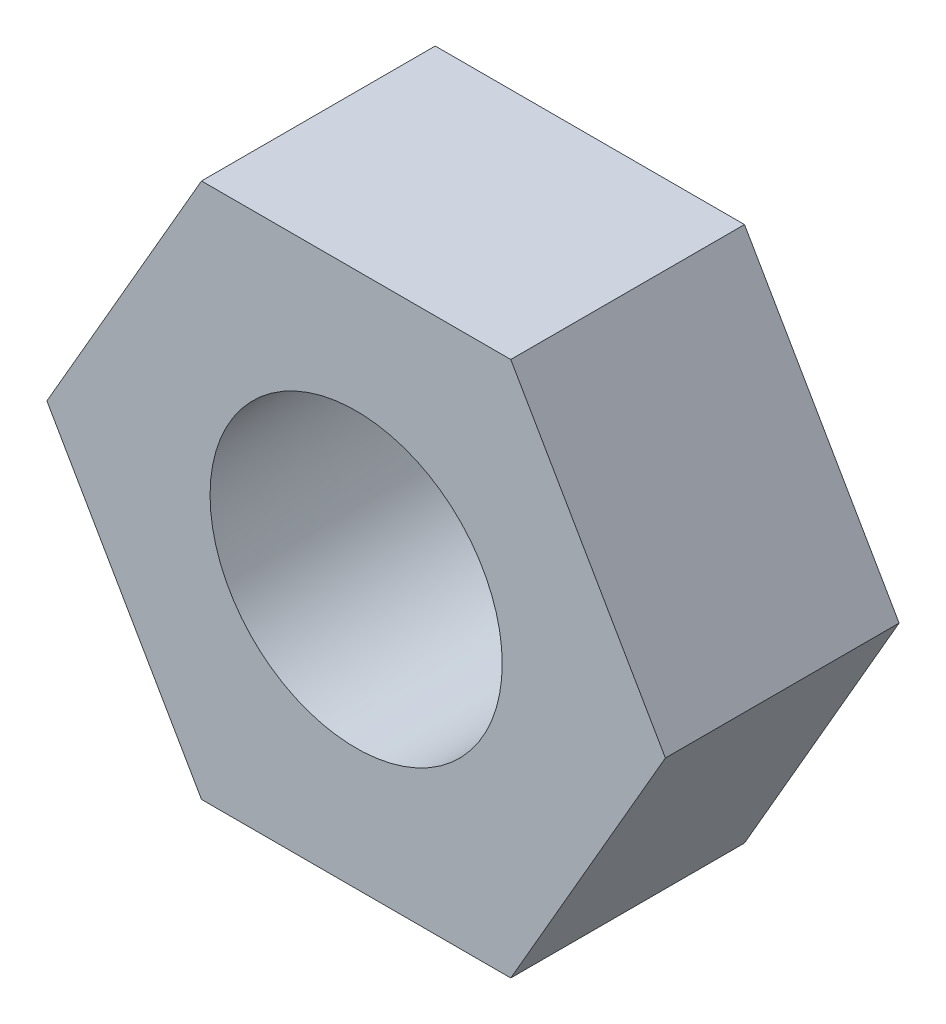
ISO-10303-21;
HEADER;
FILE_DESCRIPTION(('STEP AP214'),'2;1');
FILE_NAME('part.step','',(''),(''),'','','');
FILE_SCHEMA(('AUTOMOTIVE_DESIGN { 1 0 10303 214 1 1 1 1 }'));
ENDSEC;
DATA;
#1=APPLICATION_CONTEXT('core data for automotive mechanical design processes');
#2=APPLICATION_PROTOCOL_DEFINITION('international standard','automotive_design',2000,#1);
#3=PRODUCT_CONTEXT('',#1,'mechanical');
#4=PRODUCT('Part','Part','',(#3));
#5=PRODUCT_RELATED_PRODUCT_CATEGORY('part','',(#4));
#6=PRODUCT_DEFINITION_FORMATION('','',#4);
#7=PRODUCT_DEFINITION_CONTEXT('part definition',#1,'design');
#8=PRODUCT_DEFINITION('design','',#6,#7);
#9=PRODUCT_DEFINITION_SHAPE('','',#8);
#10=(LENGTH_UNIT() NAMED_UNIT(*) SI_UNIT(.MILLI.,.METRE.));
#11=(NAMED_UNIT(*) PLANE_ANGLE_UNIT() SI_UNIT($,.RADIAN.));
#12=(NAMED_UNIT(*) SI_UNIT($,.STERADIAN.) SOLID_ANGLE_UNIT());
#13=UNCERTAINTY_MEASURE_WITH_UNIT(LENGTH_MEASURE(1.E-05),#10,'distance_accuracy_value','');
#14=(GEOMETRIC_REPRESENTATION_CONTEXT(3) GLOBAL_UNCERTAINTY_ASSIGNED_CONTEXT((#13)) GLOBAL_UNIT_ASSIGNED_CONTEXT((#10,
#11,#12)) REPRESENTATION_CONTEXT('',''));
#15=CARTESIAN_POINT('',(0.,0.,0.));
#16=DIRECTION('',(0.,0.,1.));
#17=DIRECTION('',(1.,0.,0.));
#18=AXIS2_PLACEMENT_3D('',#15,#16,#17);
#19=CARTESIAN_POINT('',(1.58771324027147,-2.75,2.4));
#20=DIRECTION('',(-0.866025403784438,0.5,0.));
#21=DIRECTION('',(-0.5,-0.866025403784439,0.));
#22=AXIS2_PLACEMENT_3D('',#19,#20,#21);
#23=PLANE('',#22);
#24=DIRECTION('',(0.5,0.866025403784438,0.));
#25=VECTOR('',#24,1.);
#26=CARTESIAN_POINT('',(1.58771324027147,-2.75,0.));
#27=LINE('',#26,#25);
#28=CARTESIAN_POINT('',(1.58771324027147,-2.75,0.));
#29=VERTEX_POINT('',#28);
#30=CARTESIAN_POINT('',(3.17542648054294,0.,0.));
#31=VERTEX_POINT('',#30);
#32=EDGE_CURVE('E128',#29,#31,#27,.T.);
#33=ORIENTED_EDGE('',*,*,#32,.T.);
#34=DIRECTION('',(0.,0.,-1.));
#35=VECTOR('',#34,1.);
#36=CARTESIAN_POINT('',(3.17542648054294,0.,2.4));
#37=LINE('',#36,#35);
#38=CARTESIAN_POINT('',(3.17542648054294,0.,2.4));
#39=VERTEX_POINT('',#38);
#40=EDGE_CURVE('E11',#39,#31,#37,.T.);
#41=ORIENTED_EDGE('',*,*,#40,.F.);
#42=DIRECTION('',(0.5,0.866025403784438,0.));
#43=VECTOR('',#42,1.);
#44=CARTESIAN_POINT('',(1.58771324027147,-2.75,2.4));
#45=LINE('',#44,#43);
#46=CARTESIAN_POINT('',(1.58771324027147,-2.75,2.4));
#47=VERTEX_POINT('',#46);
#48=EDGE_CURVE('E145',#47,#39,#45,.T.);
#49=ORIENTED_EDGE('',*,*,#48,.F.);
#50=DIRECTION('',(0.,0.,-1.));
#51=VECTOR('',#50,1.);
#52=CARTESIAN_POINT('',(1.58771324027147,-2.75,2.4));
#53=LINE('',#52,#51);
#54=EDGE_CURVE('E124',#47,#29,#53,.T.);
#55=ORIENTED_EDGE('',*,*,#54,.T.);
#56=EDGE_LOOP('',(#33,#41,#49,#55));
#57=FACE_BOUND('',#56,.T.);
#58=ADVANCED_FACE('F39',(#57),#23,.F.);
#59=CARTESIAN_POINT('',(3.17542648054294,0.,2.4));
#60=DIRECTION('',(-0.866025403784439,-0.499999999999999,0.));
#61=DIRECTION('',(0.5,-0.866025403784439,0.));
#62=AXIS2_PLACEMENT_3D('',#59,#60,#61);
#63=PLANE('',#62);
#64=DIRECTION('',(-0.499999999999999,0.866025403784439,0.));
#65=VECTOR('',#64,1.);
#66=CARTESIAN_POINT('',(3.17542648054294,0.,0.));
#67=LINE('',#66,#65);
#68=CARTESIAN_POINT('',(1.58771324027147,2.75,0.));
#69=VERTEX_POINT('',#68);
#70=EDGE_CURVE('E132',#31,#69,#67,.T.);
#71=ORIENTED_EDGE('',*,*,#70,.T.);
#72=DIRECTION('',(0.,0.,-1.));
#73=VECTOR('',#72,1.);
#74=CARTESIAN_POINT('',(1.58771324027147,2.75,2.4));
#75=LINE('',#74,#73);
#76=CARTESIAN_POINT('',(1.58771324027147,2.75,2.4));
#77=VERTEX_POINT('',#76);
#78=EDGE_CURVE('E48',#77,#69,#75,.T.);
#79=ORIENTED_EDGE('',*,*,#78,.F.);
#80=DIRECTION('',(-0.499999999999999,0.866025403784439,0.));
#81=VECTOR('',#80,1.);
#82=CARTESIAN_POINT('',(3.17542648054294,0.,2.4));
#83=LINE('',#82,#81);
#84=EDGE_CURVE('E93',#39,#77,#83,.T.);
#85=ORIENTED_EDGE('',*,*,#84,.F.);
#86=ORIENTED_EDGE('',*,*,#40,.T.);
#87=EDGE_LOOP('',(#71,#79,#85,#86));
#88=FACE_BOUND('',#87,.T.);
#89=ADVANCED_FACE('F174',(#88),#63,.F.);
#90=CARTESIAN_POINT('',(1.58771324027147,2.75,2.4));
#91=DIRECTION('',(0.,-1.,0.));
#92=DIRECTION('',(0.,0.,-1.));
#93=AXIS2_PLACEMENT_3D('',#90,#91,#92);
#94=PLANE('',#93);
#95=DIRECTION('',(-1.,0.,0.));
#96=VECTOR('',#95,1.);
#97=CARTESIAN_POINT('',(1.58771324027147,2.75,0.));
#98=LINE('',#97,#96);
#99=CARTESIAN_POINT('',(-1.58771324027147,2.75,0.));
#100=VERTEX_POINT('',#99);
#101=EDGE_CURVE('E136',#69,#100,#98,.T.);
#102=ORIENTED_EDGE('',*,*,#101,.T.);
#103=DIRECTION('',(0.,0.,-1.));
#104=VECTOR('',#103,1.);
#105=CARTESIAN_POINT('',(-1.58771324027147,2.75,2.4));
#106=LINE('',#105,#104);
#107=CARTESIAN_POINT('',(-1.58771324027147,2.75,2.4));
#108=VERTEX_POINT('',#107);
#109=EDGE_CURVE('E117',#108,#100,#106,.T.);
#110=ORIENTED_EDGE('',*,*,#109,.F.);
#111=DIRECTION('',(-1.,0.,0.));
#112=VECTOR('',#111,1.);
#113=CARTESIAN_POINT('',(1.58771324027147,2.75,2.4));
#114=LINE('',#113,#112);
#115=EDGE_CURVE('E106',#77,#108,#114,.T.);
#116=ORIENTED_EDGE('',*,*,#115,.F.);
#117=ORIENTED_EDGE('',*,*,#78,.T.);
#118=EDGE_LOOP('',(#102,#110,#116,#117));
#119=FACE_BOUND('',#118,.T.);
#120=ADVANCED_FACE('F155',(#119),#94,.F.);
#121=CARTESIAN_POINT('',(-1.58771324027147,2.75,2.4));
#122=DIRECTION('',(0.866025403784438,-0.5,0.));
#123=DIRECTION('',(0.5,0.866025403784439,0.));
#124=AXIS2_PLACEMENT_3D('',#121,#122,#123);
#125=PLANE('',#124);
#126=DIRECTION('',(-0.5,-0.866025403784438,0.));
#127=VECTOR('',#126,1.);
#128=CARTESIAN_POINT('',(-1.58771324027147,2.75,0.));
#129=LINE('',#128,#127);
#130=CARTESIAN_POINT('',(-3.17542648054294,0.,0.));
#131=VERTEX_POINT('',#130);
#132=EDGE_CURVE('E115',#100,#131,#129,.T.);
#133=ORIENTED_EDGE('',*,*,#132,.T.);
#134=DIRECTION('',(0.,0.,-1.));
#135=VECTOR('',#134,1.);
#136=CARTESIAN_POINT('',(-3.17542648054294,0.,2.4));
#137=LINE('',#136,#135);
#138=CARTESIAN_POINT('',(-3.17542648054294,0.,2.4));
#139=VERTEX_POINT('',#138);
#140=EDGE_CURVE('E112',#139,#131,#137,.T.);
#141=ORIENTED_EDGE('',*,*,#140,.F.);
#142=DIRECTION('',(-0.5,-0.866025403784438,0.));
#143=VECTOR('',#142,1.);
#144=CARTESIAN_POINT('',(-1.58771324027147,2.75,2.4));
#145=LINE('',#144,#143);
#146=EDGE_CURVE('E100',#108,#139,#145,.T.);
#147=ORIENTED_EDGE('',*,*,#146,.F.);
#148=ORIENTED_EDGE('',*,*,#109,.T.);
#149=EDGE_LOOP('',(#133,#141,#147,#148));
#150=FACE_BOUND('',#149,.T.);
#151=ADVANCED_FACE('F113',(#150),#125,.F.);
#152=CARTESIAN_POINT('',(-3.17542648054294,0.,2.4));
#153=DIRECTION('',(0.866025403784439,0.5,0.));
#154=DIRECTION('',(-0.5,0.866025403784439,0.));
#155=AXIS2_PLACEMENT_3D('',#152,#153,#154);
#156=PLANE('',#155);
#157=DIRECTION('',(0.5,-0.866025403784439,0.));
#158=VECTOR('',#157,1.);
#159=CARTESIAN_POINT('',(-3.17542648054294,0.,0.));
#160=LINE('',#159,#158);
#161=CARTESIAN_POINT('',(-1.58771324027147,-2.75,0.));
#162=VERTEX_POINT('',#161);
#163=EDGE_CURVE('E79',#131,#162,#160,.T.);
#164=ORIENTED_EDGE('',*,*,#163,.T.);
#165=DIRECTION('',(0.,0.,-1.));
#166=VECTOR('',#165,1.);
#167=CARTESIAN_POINT('',(-1.58771324027147,-2.75,2.4));
#168=LINE('',#167,#166);
#169=CARTESIAN_POINT('',(-1.58771324027147,-2.75,2.4));
#170=VERTEX_POINT('',#169);
#171=EDGE_CURVE('E118',#170,#162,#168,.T.);
#172=ORIENTED_EDGE('',*,*,#171,.F.);
#173=DIRECTION('',(0.5,-0.866025403784439,0.));
#174=VECTOR('',#173,1.);
#175=CARTESIAN_POINT('',(-3.17542648054294,0.,2.4));
#176=LINE('',#175,#174);
#177=EDGE_CURVE('E104',#139,#170,#176,.T.);
#178=ORIENTED_EDGE('',*,*,#177,.F.);
#179=ORIENTED_EDGE('',*,*,#140,.T.);
#180=EDGE_LOOP('',(#164,#172,#178,#179));
#181=FACE_BOUND('',#180,.T.);
#182=ADVANCED_FACE('F120',(#181),#156,.F.);
#183=CARTESIAN_POINT('',(-1.58771324027147,-2.75,2.4));
#184=DIRECTION('',(0.,1.,0.));
#185=DIRECTION('',(-1.,0.,0.));
#186=AXIS2_PLACEMENT_3D('',#183,#184,#185);
#187=PLANE('',#186);
#188=DIRECTION('',(1.,0.,0.));
#189=VECTOR('',#188,1.);
#190=CARTESIAN_POINT('',(-1.58771324027147,-2.75,0.));
#191=LINE('',#190,#189);
#192=EDGE_CURVE('E85',#162,#29,#191,.T.);
#193=ORIENTED_EDGE('',*,*,#192,.T.);
#194=ORIENTED_EDGE('',*,*,#54,.F.);
#195=DIRECTION('',(1.,0.,0.));
#196=VECTOR('',#195,1.);
#197=CARTESIAN_POINT('',(-1.58771324027147,-2.75,2.4));
#198=LINE('',#197,#196);
#199=EDGE_CURVE('E56',#170,#47,#198,.T.);
#200=ORIENTED_EDGE('',*,*,#199,.F.);
#201=ORIENTED_EDGE('',*,*,#171,.T.);
#202=EDGE_LOOP('',(#193,#194,#200,#201));
#203=FACE_BOUND('',#202,.T.);
#204=ADVANCED_FACE('F162',(#203),#187,.F.);
#205=CARTESIAN_POINT('',(0.,0.,2.4));
#206=DIRECTION('',(0.,0.,1.));
#207=DIRECTION('',(1.,0.,0.));
#208=AXIS2_PLACEMENT_3D('',#205,#206,#207);
#209=PLANE('',#208);
#210=CARTESIAN_POINT('',(0.,0.,2.4));
#211=DIRECTION('',(0.,0.,-1.));
#212=DIRECTION('',(-1.,0.,0.));
#213=AXIS2_PLACEMENT_3D('',#210,#211,#212);
#214=CIRCLE('',#213,1.5);
#215=CARTESIAN_POINT('',(-1.5,0.,2.4));
#216=VERTEX_POINT('',#215);
#217=EDGE_CURVE('E133',#216,#216,#214,.T.);
#218=ORIENTED_EDGE('',*,*,#217,.T.);
#219=EDGE_LOOP('',(#218));
#220=FACE_BOUND('',#219,.T.);
#221=ORIENTED_EDGE('',*,*,#48,.T.);
#222=ORIENTED_EDGE('',*,*,#84,.T.);
#223=ORIENTED_EDGE('',*,*,#115,.T.);
#224=ORIENTED_EDGE('',*,*,#146,.T.);
#225=ORIENTED_EDGE('',*,*,#177,.T.);
#226=ORIENTED_EDGE('',*,*,#199,.T.);
#227=EDGE_LOOP('',(#221,#222,#223,#224,#225,#226));
#228=FACE_BOUND('',#227,.T.);
#229=ADVANCED_FACE('F102',(#220,#228),#209,.T.);
#230=CARTESIAN_POINT('',(0.,0.,0.));
#231=DIRECTION('',(0.,0.,1.));
#232=DIRECTION('',(1.,0.,0.));
#233=AXIS2_PLACEMENT_3D('',#230,#231,#232);
#234=PLANE('',#233);
#235=CARTESIAN_POINT('',(0.,0.,0.));
#236=DIRECTION('',(0.,0.,-1.));
#237=DIRECTION('',(-1.,0.,0.));
#238=AXIS2_PLACEMENT_3D('',#235,#236,#237);
#239=CIRCLE('',#238,1.5);
#240=CARTESIAN_POINT('',(-1.5,0.,0.));
#241=VERTEX_POINT('',#240);
#242=EDGE_CURVE('E229',#241,#241,#239,.T.);
#243=ORIENTED_EDGE('',*,*,#242,.F.);
#244=EDGE_LOOP('',(#243));
#245=FACE_BOUND('',#244,.T.);
#246=ORIENTED_EDGE('',*,*,#32,.F.);
#247=ORIENTED_EDGE('',*,*,#192,.F.);
#248=ORIENTED_EDGE('',*,*,#163,.F.);
#249=ORIENTED_EDGE('',*,*,#132,.F.);
#250=ORIENTED_EDGE('',*,*,#101,.F.);
#251=ORIENTED_EDGE('',*,*,#70,.F.);
#252=EDGE_LOOP('',(#246,#247,#248,#249,#250,#251));
#253=FACE_BOUND('',#252,.T.);
#254=ADVANCED_FACE('F158',(#245,#253),#234,.F.);
#255=CARTESIAN_POINT('',(0.,0.,2.4));
#256=DIRECTION('',(0.,0.,-1.));
#257=DIRECTION('',(-1.,0.,0.));
#258=AXIS2_PLACEMENT_3D('',#255,#256,#257);
#259=CYLINDRICAL_SURFACE('',#258,1.5);
#260=ORIENTED_EDGE('',*,*,#217,.F.);
#261=EDGE_LOOP('',(#260));
#262=FACE_BOUND('',#261,.T.);
#263=ORIENTED_EDGE('',*,*,#242,.T.);
#264=EDGE_LOOP('',(#263));
#265=FACE_BOUND('',#264,.T.);
#266=ADVANCED_FACE('F211',(#262,#265),#259,.F.);
#267=CLOSED_SHELL('',(#58,#89,#120,#151,#182,#204,#229,#254,#266));
#268=MANIFOLD_SOLID_BREP('B2',#267);
#269=ADVANCED_BREP_SHAPE_REPRESENTATION('',(#18,#268),#14);
#270=SHAPE_DEFINITION_REPRESENTATION(#9,#269);
ENDSEC;
END-ISO-10303-21;
